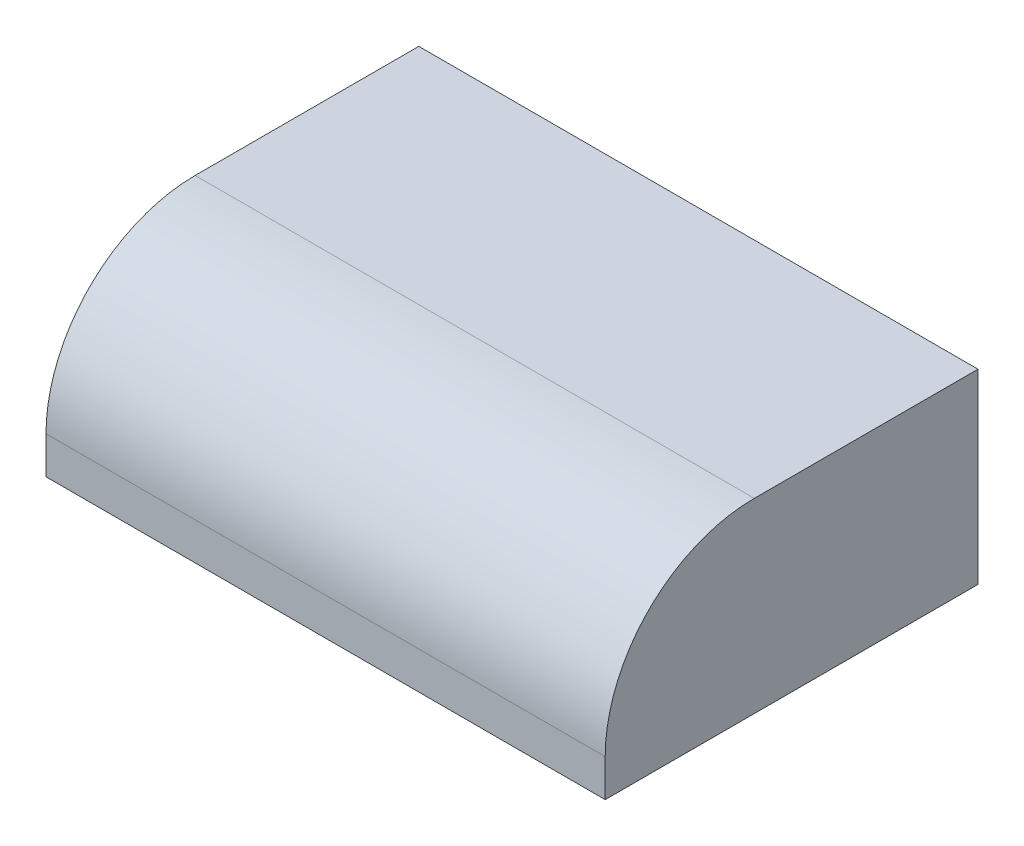
ISO-10303-21;
HEADER;
FILE_DESCRIPTION(('STEP AP214'),'2;1');
FILE_NAME('part.step','',(''),(''),'','','');
FILE_SCHEMA(('AUTOMOTIVE_DESIGN { 1 0 10303 214 1 1 1 1 }'));
ENDSEC;
DATA;
#1=APPLICATION_CONTEXT('core data for automotive mechanical design processes');
#2=APPLICATION_PROTOCOL_DEFINITION('international standard','automotive_design',2000,#1);
#3=PRODUCT_CONTEXT('',#1,'mechanical');
#4=PRODUCT('Part','Part','',(#3));
#5=PRODUCT_RELATED_PRODUCT_CATEGORY('part','',(#4));
#6=PRODUCT_DEFINITION_FORMATION('','',#4);
#7=PRODUCT_DEFINITION_CONTEXT('part definition',#1,'design');
#8=PRODUCT_DEFINITION('design','',#6,#7);
#9=PRODUCT_DEFINITION_SHAPE('','',#8);
#10=(LENGTH_UNIT() NAMED_UNIT(*) SI_UNIT(.MILLI.,.METRE.));
#11=(NAMED_UNIT(*) PLANE_ANGLE_UNIT() SI_UNIT($,.RADIAN.));
#12=(NAMED_UNIT(*) SI_UNIT($,.STERADIAN.) SOLID_ANGLE_UNIT());
#13=UNCERTAINTY_MEASURE_WITH_UNIT(LENGTH_MEASURE(1.E-05),#10,'distance_accuracy_value','');
#14=(GEOMETRIC_REPRESENTATION_CONTEXT(3) GLOBAL_UNCERTAINTY_ASSIGNED_CONTEXT((#13)) GLOBAL_UNIT_ASSIGNED_CONTEXT((#10,
#11,#12)) REPRESENTATION_CONTEXT('',''));
#15=CARTESIAN_POINT('',(0.,0.,0.));
#16=DIRECTION('',(0.,0.,1.));
#17=DIRECTION('',(1.,0.,0.));
#18=AXIS2_PLACEMENT_3D('',#15,#16,#17);
#19=CARTESIAN_POINT('',(4.7625,3.175,3.175));
#20=DIRECTION('',(-1.,0.,0.));
#21=DIRECTION('',(0.,0.,1.));
#22=AXIS2_PLACEMENT_3D('',#19,#20,#21);
#23=PLANE('',#22);
#24=DIRECTION('',(0.,0.,-1.));
#25=VECTOR('',#24,1.);
#26=CARTESIAN_POINT('',(4.7625,3.175,3.175));
#27=LINE('',#26,#25);
#28=CARTESIAN_POINT('',(4.7625,3.175,0.635));
#29=VERTEX_POINT('',#28);
#30=CARTESIAN_POINT('',(4.7625,3.175,-3.175));
#31=VERTEX_POINT('',#30);
#32=EDGE_CURVE('E77',#29,#31,#27,.T.);
#33=ORIENTED_EDGE('',*,*,#32,.F.);
#34=CARTESIAN_POINT('',(4.7625,0.635,0.635));
#35=DIRECTION('',(-1.,0.,0.));
#36=DIRECTION('',(0.,0.,1.));
#37=AXIS2_PLACEMENT_3D('',#34,#35,#36);
#38=CIRCLE('',#37,2.54);
#39=CARTESIAN_POINT('',(4.7625,0.635,3.175));
#40=VERTEX_POINT('',#39);
#41=EDGE_CURVE('E55',#29,#40,#38,.F.);
#42=ORIENTED_EDGE('',*,*,#41,.T.);
#43=DIRECTION('',(0.,-1.,0.));
#44=VECTOR('',#43,1.);
#45=CARTESIAN_POINT('',(4.7625,3.175,3.175));
#46=LINE('',#45,#44);
#47=CARTESIAN_POINT('',(4.7625,0.,3.175));
#48=VERTEX_POINT('',#47);
#49=EDGE_CURVE('E107',#40,#48,#46,.T.);
#50=ORIENTED_EDGE('',*,*,#49,.T.);
#51=DIRECTION('',(0.,0.,-1.));
#52=VECTOR('',#51,1.);
#53=CARTESIAN_POINT('',(4.7625,0.,3.175));
#54=LINE('',#53,#52);
#55=CARTESIAN_POINT('',(4.7625,0.,-3.175));
#56=VERTEX_POINT('',#55);
#57=EDGE_CURVE('E99',#48,#56,#54,.T.);
#58=ORIENTED_EDGE('',*,*,#57,.T.);
#59=DIRECTION('',(0.,-1.,0.));
#60=VECTOR('',#59,1.);
#61=CARTESIAN_POINT('',(4.7625,3.175,-3.175));
#62=LINE('',#61,#60);
#63=EDGE_CURVE('E91',#31,#56,#62,.T.);
#64=ORIENTED_EDGE('',*,*,#63,.F.);
#65=EDGE_LOOP('',(#33,#42,#50,#58,#64));
#66=FACE_BOUND('',#65,.T.);
#67=ADVANCED_FACE('F33',(#66),#23,.F.);
#68=CARTESIAN_POINT('',(-4.7625,3.175,-3.175));
#69=DIRECTION('',(0.,0.,1.));
#70=DIRECTION('',(1.,0.,0.));
#71=AXIS2_PLACEMENT_3D('',#68,#69,#70);
#72=PLANE('',#71);
#73=DIRECTION('',(-1.,0.,0.));
#74=VECTOR('',#73,1.);
#75=CARTESIAN_POINT('',(-4.7625,0.,-3.175));
#76=LINE('',#75,#74);
#77=CARTESIAN_POINT('',(-4.7625,0.,-3.175));
#78=VERTEX_POINT('',#77);
#79=EDGE_CURVE('E114',#56,#78,#76,.T.);
#80=ORIENTED_EDGE('',*,*,#79,.T.);
#81=DIRECTION('',(0.,-1.,0.));
#82=VECTOR('',#81,1.);
#83=CARTESIAN_POINT('',(-4.7625,3.175,-3.175));
#84=LINE('',#83,#82);
#85=CARTESIAN_POINT('',(-4.7625,3.175,-3.175));
#86=VERTEX_POINT('',#85);
#87=EDGE_CURVE('E94',#86,#78,#84,.T.);
#88=ORIENTED_EDGE('',*,*,#87,.F.);
#89=DIRECTION('',(-1.,0.,0.));
#90=VECTOR('',#89,1.);
#91=CARTESIAN_POINT('',(-4.7625,3.175,-3.175));
#92=LINE('',#91,#90);
#93=EDGE_CURVE('E81',#31,#86,#92,.T.);
#94=ORIENTED_EDGE('',*,*,#93,.F.);
#95=ORIENTED_EDGE('',*,*,#63,.T.);
#96=EDGE_LOOP('',(#80,#88,#94,#95));
#97=FACE_BOUND('',#96,.T.);
#98=ADVANCED_FACE('F90',(#97),#72,.F.);
#99=CARTESIAN_POINT('',(-4.7625,3.175,3.175));
#100=DIRECTION('',(1.,0.,0.));
#101=DIRECTION('',(0.,0.,-1.));
#102=AXIS2_PLACEMENT_3D('',#99,#100,#101);
#103=PLANE('',#102);
#104=DIRECTION('',(0.,-1.,0.));
#105=VECTOR('',#104,1.);
#106=CARTESIAN_POINT('',(-4.7625,3.175,3.175));
#107=LINE('',#106,#105);
#108=CARTESIAN_POINT('',(-4.7625,0.635,3.175));
#109=VERTEX_POINT('',#108);
#110=CARTESIAN_POINT('',(-4.7625,0.,3.175));
#111=VERTEX_POINT('',#110);
#112=EDGE_CURVE('E102',#109,#111,#107,.T.);
#113=ORIENTED_EDGE('',*,*,#112,.F.);
#114=CARTESIAN_POINT('',(-4.7625,0.635,0.635));
#115=DIRECTION('',(1.,0.,0.));
#116=DIRECTION('',(0.,0.,-1.));
#117=AXIS2_PLACEMENT_3D('',#114,#115,#116);
#118=CIRCLE('',#117,2.54);
#119=CARTESIAN_POINT('',(-4.7625,3.175,0.635));
#120=VERTEX_POINT('',#119);
#121=EDGE_CURVE('E11',#109,#120,#118,.F.);
#122=ORIENTED_EDGE('',*,*,#121,.T.);
#123=DIRECTION('',(0.,0.,1.));
#124=VECTOR('',#123,1.);
#125=CARTESIAN_POINT('',(-4.7625,3.175,3.175));
#126=LINE('',#125,#124);
#127=EDGE_CURVE('E96',#86,#120,#126,.T.);
#128=ORIENTED_EDGE('',*,*,#127,.F.);
#129=ORIENTED_EDGE('',*,*,#87,.T.);
#130=DIRECTION('',(0.,0.,1.));
#131=VECTOR('',#130,1.);
#132=CARTESIAN_POINT('',(-4.7625,0.,3.175));
#133=LINE('',#132,#131);
#134=EDGE_CURVE('E111',#78,#111,#133,.T.);
#135=ORIENTED_EDGE('',*,*,#134,.T.);
#136=EDGE_LOOP('',(#113,#122,#128,#129,#135));
#137=FACE_BOUND('',#136,.T.);
#138=ADVANCED_FACE('F120',(#137),#103,.F.);
#139=CARTESIAN_POINT('',(-4.7625,3.175,3.175));
#140=DIRECTION('',(0.,0.,-1.));
#141=DIRECTION('',(-1.,0.,0.));
#142=AXIS2_PLACEMENT_3D('',#139,#140,#141);
#143=PLANE('',#142);
#144=ORIENTED_EDGE('',*,*,#49,.F.);
#145=DIRECTION('',(1.,0.,0.));
#146=VECTOR('',#145,1.);
#147=CARTESIAN_POINT('',(-4.7625,0.635,3.175));
#148=LINE('',#147,#146);
#149=EDGE_CURVE('E41',#40,#109,#148,.F.);
#150=ORIENTED_EDGE('',*,*,#149,.T.);
#151=ORIENTED_EDGE('',*,*,#112,.T.);
#152=DIRECTION('',(1.,0.,0.));
#153=VECTOR('',#152,1.);
#154=CARTESIAN_POINT('',(-4.7625,0.,3.175));
#155=LINE('',#154,#153);
#156=EDGE_CURVE('E86',#111,#48,#155,.T.);
#157=ORIENTED_EDGE('',*,*,#156,.T.);
#158=EDGE_LOOP('',(#144,#150,#151,#157));
#159=FACE_BOUND('',#158,.T.);
#160=ADVANCED_FACE('F123',(#159),#143,.F.);
#161=CARTESIAN_POINT('',(4.76249999999999,3.175,-3.175));
#162=DIRECTION('',(0.,-1.,0.));
#163=DIRECTION('',(0.,0.,-1.));
#164=AXIS2_PLACEMENT_3D('',#161,#162,#163);
#165=PLANE('',#164);
#166=ORIENTED_EDGE('',*,*,#127,.T.);
#167=DIRECTION('',(1.,0.,0.));
#168=VECTOR('',#167,1.);
#169=CARTESIAN_POINT('',(4.76249999999999,3.175,0.635));
#170=LINE('',#169,#168);
#171=EDGE_CURVE('E84',#120,#29,#170,.T.);
#172=ORIENTED_EDGE('',*,*,#171,.T.);
#173=ORIENTED_EDGE('',*,*,#32,.T.);
#174=ORIENTED_EDGE('',*,*,#93,.T.);
#175=EDGE_LOOP('',(#166,#172,#173,#174));
#176=FACE_BOUND('',#175,.T.);
#177=ADVANCED_FACE('F80',(#176),#165,.F.);
#178=CARTESIAN_POINT('',(4.76249999999999,0.,-3.175));
#179=DIRECTION('',(0.,-1.,0.));
#180=DIRECTION('',(0.,0.,-1.));
#181=AXIS2_PLACEMENT_3D('',#178,#179,#180);
#182=PLANE('',#181);
#183=ORIENTED_EDGE('',*,*,#57,.F.);
#184=ORIENTED_EDGE('',*,*,#156,.F.);
#185=ORIENTED_EDGE('',*,*,#134,.F.);
#186=ORIENTED_EDGE('',*,*,#79,.F.);
#187=EDGE_LOOP('',(#183,#184,#185,#186));
#188=FACE_BOUND('',#187,.T.);
#189=ADVANCED_FACE('F125',(#188),#182,.T.);
#190=CARTESIAN_POINT('',(4.76249999999999,0.635,0.635));
#191=DIRECTION('',(1.,0.,0.));
#192=DIRECTION('',(0.,0.,-1.));
#193=AXIS2_PLACEMENT_3D('',#190,#191,#192);
#194=CYLINDRICAL_SURFACE('',#193,2.54);
#195=ORIENTED_EDGE('',*,*,#121,.F.);
#196=ORIENTED_EDGE('',*,*,#149,.F.);
#197=ORIENTED_EDGE('',*,*,#41,.F.);
#198=ORIENTED_EDGE('',*,*,#171,.F.);
#199=EDGE_LOOP('',(#195,#196,#197,#198));
#200=FACE_BOUND('',#199,.T.);
#201=ADVANCED_FACE('F35',(#200),#194,.T.);
#202=CLOSED_SHELL('',(#67,#98,#138,#160,#177,#189,#201));
#203=MANIFOLD_SOLID_BREP('B2',#202);
#204=ADVANCED_BREP_SHAPE_REPRESENTATION('',(#18,#203),#14);
#205=SHAPE_DEFINITION_REPRESENTATION(#9,#204);
ENDSEC;
END-ISO-10303-21;
